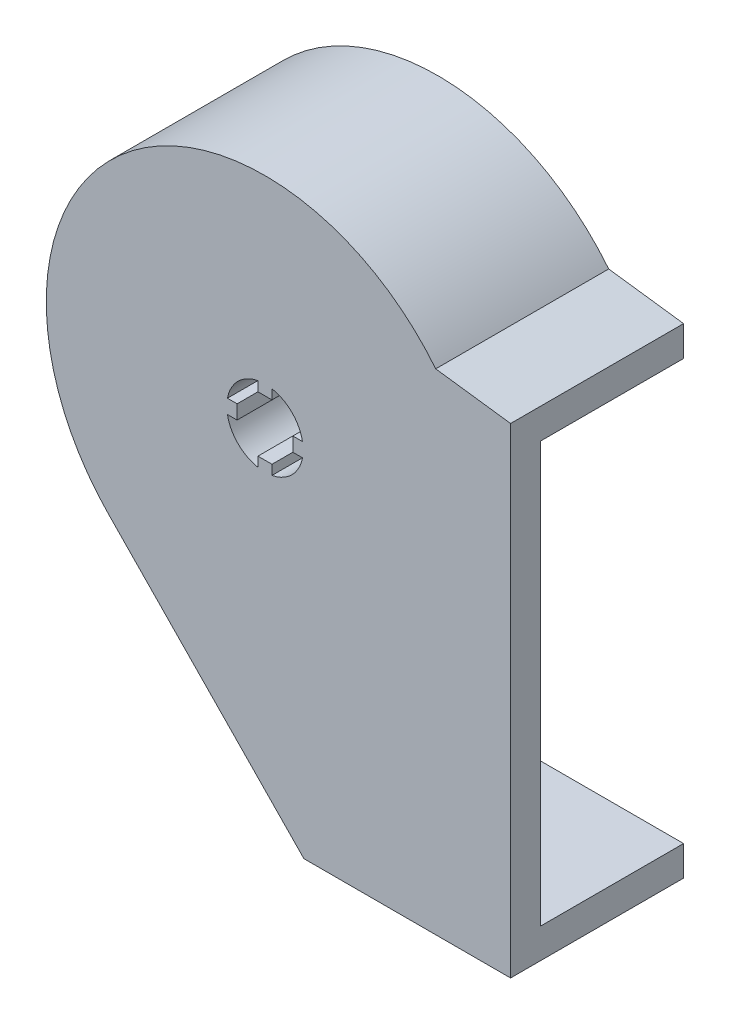
ISO-10303-21;
HEADER;
FILE_DESCRIPTION(('STEP AP214'),'2;1');
FILE_NAME('part.step','',(''),(''),'','','');
FILE_SCHEMA(('AUTOMOTIVE_DESIGN { 1 0 10303 214 1 1 1 1 }'));
ENDSEC;
DATA;
#1=APPLICATION_CONTEXT('core data for automotive mechanical design processes');
#2=APPLICATION_PROTOCOL_DEFINITION('international standard','automotive_design',2000,#1);
#3=PRODUCT_CONTEXT('',#1,'mechanical');
#4=PRODUCT('Part','Part','',(#3));
#5=PRODUCT_RELATED_PRODUCT_CATEGORY('part','',(#4));
#6=PRODUCT_DEFINITION_FORMATION('','',#4);
#7=PRODUCT_DEFINITION_CONTEXT('part definition',#1,'design');
#8=PRODUCT_DEFINITION('design','',#6,#7);
#9=PRODUCT_DEFINITION_SHAPE('','',#8);
#10=(LENGTH_UNIT() NAMED_UNIT(*) SI_UNIT(.MILLI.,.METRE.));
#11=(NAMED_UNIT(*) PLANE_ANGLE_UNIT() SI_UNIT($,.RADIAN.));
#12=(NAMED_UNIT(*) SI_UNIT($,.STERADIAN.) SOLID_ANGLE_UNIT());
#13=UNCERTAINTY_MEASURE_WITH_UNIT(LENGTH_MEASURE(1.E-05),#10,'distance_accuracy_value','');
#14=(GEOMETRIC_REPRESENTATION_CONTEXT(3) GLOBAL_UNCERTAINTY_ASSIGNED_CONTEXT((#13)) GLOBAL_UNIT_ASSIGNED_CONTEXT((#10,
#11,#12)) REPRESENTATION_CONTEXT('',''));
#15=CARTESIAN_POINT('',(0.,0.,0.));
#16=DIRECTION('',(0.,0.,1.));
#17=DIRECTION('',(1.,0.,0.));
#18=AXIS2_PLACEMENT_3D('',#15,#16,#17);
#19=CARTESIAN_POINT('',(0.,0.,0.));
#20=DIRECTION('',(0.,0.,1.));
#21=DIRECTION('',(1.,0.,0.));
#22=AXIS2_PLACEMENT_3D('',#19,#20,#21);
#23=PLANE('',#22);
#24=DIRECTION('',(0.697581146157718,-0.716505788200824,0.));
#25=VECTOR('',#24,1.);
#26=CARTESIAN_POINT('',(20.1650578820082,-111.024188538423,0.));
#27=LINE('',#26,#25);
#28=CARTESIAN_POINT('',(-45.139864656652,-43.9476122079362,0.));
#29=VERTEX_POINT('',#28);
#30=CARTESIAN_POINT('',(17.2207454401962,-108.,0.));
#31=VERTEX_POINT('',#30);
#32=EDGE_CURVE('E292',#29,#31,#27,.T.);
#33=ORIENTED_EDGE('',*,*,#32,.T.);
#34=DIRECTION('',(1.,0.,0.));
#35=VECTOR('',#34,1.);
#36=CARTESIAN_POINT('',(191.,-108.,0.));
#37=LINE('',#36,#35);
#38=CARTESIAN_POINT('',(82.,-108.,0.));
#39=VERTEX_POINT('',#38);
#40=EDGE_CURVE('E48',#31,#39,#37,.T.);
#41=ORIENTED_EDGE('',*,*,#40,.T.);
#42=DIRECTION('',(0.,-1.,0.));
#43=VECTOR('',#42,1.);
#44=CARTESIAN_POINT('',(82.,0.,0.));
#45=LINE('',#44,#43);
#46=CARTESIAN_POINT('',(82.,-118.,0.));
#47=VERTEX_POINT('',#46);
#48=EDGE_CURVE('E55',#39,#47,#45,.T.);
#49=ORIENTED_EDGE('',*,*,#48,.T.);
#50=DIRECTION('',(1.,0.,0.));
#51=VECTOR('',#50,1.);
#52=CARTESIAN_POINT('',(191.,-118.,0.));
#53=LINE('',#52,#51);
#54=CARTESIAN_POINT('',(13.,-118.,0.));
#55=VERTEX_POINT('',#54);
#56=EDGE_CURVE('E288',#55,#47,#53,.T.);
#57=ORIENTED_EDGE('',*,*,#56,.F.);
#58=DIRECTION('',(0.697581146157718,-0.716505788200824,0.));
#59=VECTOR('',#58,1.);
#60=CARTESIAN_POINT('',(13.,-118.,0.));
#61=LINE('',#60,#59);
#62=CARTESIAN_POINT('',(-52.3049225386602,-50.9234236695134,0.));
#63=VERTEX_POINT('',#62);
#64=EDGE_CURVE('E282',#63,#55,#61,.T.);
#65=ORIENTED_EDGE('',*,*,#64,.F.);
#66=CARTESIAN_POINT('',(0.,0.,0.));
#67=DIRECTION('',(0.,0.,1.));
#68=DIRECTION('',(1.,0.,0.));
#69=AXIS2_PLACEMENT_3D('',#66,#67,#68);
#70=CIRCLE('',#69,73.);
#71=CARTESIAN_POINT('',(57.,45.6070170039656,0.));
#72=VERTEX_POINT('',#71);
#73=EDGE_CURVE('E284',#72,#63,#70,.T.);
#74=ORIENTED_EDGE('',*,*,#73,.F.);
#75=DIRECTION('',(-0.991422127874872,0.130698754240664,0.));
#76=VECTOR('',#75,1.);
#77=CARTESIAN_POINT('',(274.,17.,0.));
#78=LINE('',#77,#76);
#79=CARTESIAN_POINT('',(82.,42.3112777177944,0.));
#80=VERTEX_POINT('',#79);
#81=EDGE_CURVE('E286',#80,#72,#78,.T.);
#82=ORIENTED_EDGE('',*,*,#81,.F.);
#83=CARTESIAN_POINT('',(82.,32.2247568314438,0.));
#84=VERTEX_POINT('',#83);
#85=EDGE_CURVE('E290',#80,#84,#45,.T.);
#86=ORIENTED_EDGE('',*,*,#85,.T.);
#87=DIRECTION('',(-0.991422127874872,0.130698754240664,0.));
#88=VECTOR('',#87,1.);
#89=CARTESIAN_POINT('',(272.693012457593,7.08577872125128,0.));
#90=LINE('',#89,#88);
#91=CARTESIAN_POINT('',(51.532195013357,36.2413145057591,0.));
#92=VERTEX_POINT('',#91);
#93=EDGE_CURVE('E221',#84,#92,#90,.T.);
#94=ORIENTED_EDGE('',*,*,#93,.T.);
#95=CARTESIAN_POINT('',(0.,0.,0.));
#96=DIRECTION('',(0.,0.,1.));
#97=DIRECTION('',(1.,0.,0.));
#98=AXIS2_PLACEMENT_3D('',#95,#96,#97);
#99=CIRCLE('',#98,63.);
#100=EDGE_CURVE('E295',#92,#29,#99,.T.);
#101=ORIENTED_EDGE('',*,*,#100,.T.);
#102=EDGE_LOOP('',(#33,#41,#49,#57,#65,#74,#82,#86,#94,#101));
#103=FACE_BOUND('',#102,.T.);
#104=ADVANCED_FACE('F40',(#103),#23,.F.);
#105=CARTESIAN_POINT('',(0.,0.,0.));
#106=DIRECTION('',(0.,0.,1.));
#107=DIRECTION('',(1.,0.,0.));
#108=AXIS2_PLACEMENT_3D('',#105,#106,#107);
#109=CIRCLE('',#108,22.75);
#110=CARTESIAN_POINT('',(22.75,0.,0.));
#111=VERTEX_POINT('',#110);
#112=EDGE_CURVE('E11',#111,#111,#109,.F.);
#113=ORIENTED_EDGE('',*,*,#112,.T.);
#114=EDGE_LOOP('',(#113));
#115=FACE_BOUND('',#114,.T.);
#116=DIRECTION('',(1.,0.,0.));
#117=VECTOR('',#116,1.);
#118=CARTESIAN_POINT('',(2.35,9.3,0.));
#119=LINE('',#118,#117);
#120=CARTESIAN_POINT('',(-2.35,9.3,0.));
#121=VERTEX_POINT('',#120);
#122=CARTESIAN_POINT('',(2.35,9.3,0.));
#123=VERTEX_POINT('',#122);
#124=EDGE_CURVE('E277',#121,#123,#119,.T.);
#125=ORIENTED_EDGE('',*,*,#124,.F.);
#126=DIRECTION('',(0.,-1.,0.));
#127=VECTOR('',#126,1.);
#128=CARTESIAN_POINT('',(-2.35,9.3,0.));
#129=LINE('',#128,#127);
#130=CARTESIAN_POINT('',(-2.35,12.5315601582564,0.));
#131=VERTEX_POINT('',#130);
#132=EDGE_CURVE('E275',#131,#121,#129,.T.);
#133=ORIENTED_EDGE('',*,*,#132,.F.);
#134=CARTESIAN_POINT('',(0.,0.,0.));
#135=DIRECTION('',(0.,0.,1.));
#136=DIRECTION('',(1.,0.,0.));
#137=AXIS2_PLACEMENT_3D('',#134,#135,#136);
#138=CIRCLE('',#137,12.75);
#139=CARTESIAN_POINT('',(-12.5315601582564,2.35,0.));
#140=VERTEX_POINT('',#139);
#141=EDGE_CURVE('E273',#140,#131,#138,.F.);
#142=ORIENTED_EDGE('',*,*,#141,.F.);
#143=DIRECTION('',(-1.,0.,0.));
#144=VECTOR('',#143,1.);
#145=CARTESIAN_POINT('',(-9.3,2.35,0.));
#146=LINE('',#145,#144);
#147=CARTESIAN_POINT('',(-9.3,2.35,0.));
#148=VERTEX_POINT('',#147);
#149=EDGE_CURVE('E271',#148,#140,#146,.T.);
#150=ORIENTED_EDGE('',*,*,#149,.F.);
#151=DIRECTION('',(0.,1.,0.));
#152=VECTOR('',#151,1.);
#153=CARTESIAN_POINT('',(-9.3,2.35,0.));
#154=LINE('',#153,#152);
#155=CARTESIAN_POINT('',(-9.3,-2.35,0.));
#156=VERTEX_POINT('',#155);
#157=EDGE_CURVE('E269',#156,#148,#154,.T.);
#158=ORIENTED_EDGE('',*,*,#157,.F.);
#159=DIRECTION('',(1.,0.,0.));
#160=VECTOR('',#159,1.);
#161=CARTESIAN_POINT('',(-9.3,-2.35,0.));
#162=LINE('',#161,#160);
#163=CARTESIAN_POINT('',(-12.5315601582564,-2.35,0.));
#164=VERTEX_POINT('',#163);
#165=EDGE_CURVE('E267',#164,#156,#162,.T.);
#166=ORIENTED_EDGE('',*,*,#165,.F.);
#167=CARTESIAN_POINT('',(0.,0.,0.));
#168=DIRECTION('',(0.,0.,1.));
#169=DIRECTION('',(1.,0.,0.));
#170=AXIS2_PLACEMENT_3D('',#167,#168,#169);
#171=CIRCLE('',#170,12.75);
#172=CARTESIAN_POINT('',(-2.35,-12.5315601582564,0.));
#173=VERTEX_POINT('',#172);
#174=EDGE_CURVE('E265',#173,#164,#171,.F.);
#175=ORIENTED_EDGE('',*,*,#174,.F.);
#176=DIRECTION('',(0.,-1.,0.));
#177=VECTOR('',#176,1.);
#178=CARTESIAN_POINT('',(-2.35,-9.3,0.));
#179=LINE('',#178,#177);
#180=CARTESIAN_POINT('',(-2.35,-9.3,0.));
#181=VERTEX_POINT('',#180);
#182=EDGE_CURVE('E263',#181,#173,#179,.T.);
#183=ORIENTED_EDGE('',*,*,#182,.F.);
#184=DIRECTION('',(-1.,0.,0.));
#185=VECTOR('',#184,1.);
#186=CARTESIAN_POINT('',(-2.35,-9.3,0.));
#187=LINE('',#186,#185);
#188=CARTESIAN_POINT('',(2.35,-9.3,0.));
#189=VERTEX_POINT('',#188);
#190=EDGE_CURVE('E261',#189,#181,#187,.T.);
#191=ORIENTED_EDGE('',*,*,#190,.F.);
#192=DIRECTION('',(0.,1.,0.));
#193=VECTOR('',#192,1.);
#194=CARTESIAN_POINT('',(2.35,-9.3,0.));
#195=LINE('',#194,#193);
#196=CARTESIAN_POINT('',(2.35,-12.5315601582564,0.));
#197=VERTEX_POINT('',#196);
#198=EDGE_CURVE('E259',#197,#189,#195,.T.);
#199=ORIENTED_EDGE('',*,*,#198,.F.);
#200=CARTESIAN_POINT('',(0.,0.,0.));
#201=DIRECTION('',(0.,0.,1.));
#202=DIRECTION('',(1.,0.,0.));
#203=AXIS2_PLACEMENT_3D('',#200,#201,#202);
#204=CIRCLE('',#203,12.75);
#205=CARTESIAN_POINT('',(12.5315601582564,-2.34999999999999,0.));
#206=VERTEX_POINT('',#205);
#207=EDGE_CURVE('E257',#206,#197,#204,.F.);
#208=ORIENTED_EDGE('',*,*,#207,.F.);
#209=DIRECTION('',(1.,0.,0.));
#210=VECTOR('',#209,1.);
#211=CARTESIAN_POINT('',(9.3,-2.35,0.));
#212=LINE('',#211,#210);
#213=CARTESIAN_POINT('',(9.3,-2.35,0.));
#214=VERTEX_POINT('',#213);
#215=EDGE_CURVE('E255',#214,#206,#212,.T.);
#216=ORIENTED_EDGE('',*,*,#215,.F.);
#217=DIRECTION('',(0.,-1.,0.));
#218=VECTOR('',#217,1.);
#219=CARTESIAN_POINT('',(9.3,-2.35,0.));
#220=LINE('',#219,#218);
#221=CARTESIAN_POINT('',(9.3,2.35,0.));
#222=VERTEX_POINT('',#221);
#223=EDGE_CURVE('E253',#222,#214,#220,.T.);
#224=ORIENTED_EDGE('',*,*,#223,.F.);
#225=DIRECTION('',(-1.,0.,0.));
#226=VECTOR('',#225,1.);
#227=CARTESIAN_POINT('',(9.3,2.35,0.));
#228=LINE('',#227,#226);
#229=CARTESIAN_POINT('',(12.5315601582564,2.35,0.));
#230=VERTEX_POINT('',#229);
#231=EDGE_CURVE('E250',#230,#222,#228,.T.);
#232=ORIENTED_EDGE('',*,*,#231,.F.);
#233=CARTESIAN_POINT('',(0.,0.,0.));
#234=DIRECTION('',(0.,0.,1.));
#235=DIRECTION('',(1.,0.,0.));
#236=AXIS2_PLACEMENT_3D('',#233,#234,#235);
#237=CIRCLE('',#236,12.75);
#238=CARTESIAN_POINT('',(2.35,12.5315601582564,0.));
#239=VERTEX_POINT('',#238);
#240=EDGE_CURVE('E248',#239,#230,#237,.F.);
#241=ORIENTED_EDGE('',*,*,#240,.F.);
#242=DIRECTION('',(0.,1.,0.));
#243=VECTOR('',#242,1.);
#244=CARTESIAN_POINT('',(2.35,9.3,0.));
#245=LINE('',#244,#243);
#246=EDGE_CURVE('E280',#123,#239,#245,.T.);
#247=ORIENTED_EDGE('',*,*,#246,.F.);
#248=EDGE_LOOP('',(#125,#133,#142,#150,#158,#166,#175,#183,#191,#199,#208,#216,#224,#232,#241,#247));
#249=FACE_BOUND('',#248,.T.);
#250=ADVANCED_FACE('F42',(#115,#249),#23,.F.);
#251=CARTESIAN_POINT('',(0.,0.,57.75));
#252=DIRECTION('',(0.,0.,-1.));
#253=DIRECTION('',(-1.,0.,0.));
#254=AXIS2_PLACEMENT_3D('',#251,#252,#253);
#255=CYLINDRICAL_SURFACE('',#254,63.);
#256=ORIENTED_EDGE('',*,*,#100,.F.);
#257=DIRECTION('',(0.,0.,-1.));
#258=VECTOR('',#257,1.);
#259=CARTESIAN_POINT('',(51.532195013357,36.2413145057591,47.75));
#260=LINE('',#259,#258);
#261=CARTESIAN_POINT('',(51.532195013357,36.2413145057591,47.75));
#262=VERTEX_POINT('',#261);
#263=EDGE_CURVE('E308',#262,#92,#260,.T.);
#264=ORIENTED_EDGE('',*,*,#263,.F.);
#265=CARTESIAN_POINT('',(0.,0.,47.75));
#266=DIRECTION('',(0.,0.,1.));
#267=DIRECTION('',(1.,0.,0.));
#268=AXIS2_PLACEMENT_3D('',#265,#266,#267);
#269=CIRCLE('',#268,63.);
#270=CARTESIAN_POINT('',(-45.139864656652,-43.9476122079362,47.75));
#271=VERTEX_POINT('',#270);
#272=EDGE_CURVE('E233',#262,#271,#269,.T.);
#273=ORIENTED_EDGE('',*,*,#272,.T.);
#274=DIRECTION('',(0.,0.,1.));
#275=VECTOR('',#274,1.);
#276=CARTESIAN_POINT('',(-45.139864656652,-43.9476122079362,57.75));
#277=LINE('',#276,#275);
#278=EDGE_CURVE('E305',#271,#29,#277,.F.);
#279=ORIENTED_EDGE('',*,*,#278,.T.);
#280=EDGE_LOOP('',(#256,#264,#273,#279));
#281=FACE_BOUND('',#280,.T.);
#282=ADVANCED_FACE('F431',(#281),#255,.F.);
#283=CARTESIAN_POINT('',(82.,0.,0.));
#284=DIRECTION('',(1.,0.,0.));
#285=DIRECTION('',(0.,0.,-1.));
#286=AXIS2_PLACEMENT_3D('',#283,#284,#285);
#287=PLANE('',#286);
#288=ORIENTED_EDGE('',*,*,#85,.F.);
#289=DIRECTION('',(0.,0.,1.));
#290=VECTOR('',#289,1.);
#291=CARTESIAN_POINT('',(82.,42.3112777177944,57.75));
#292=LINE('',#291,#290);
#293=CARTESIAN_POINT('',(82.,42.3112777177944,57.75));
#294=VERTEX_POINT('',#293);
#295=EDGE_CURVE('E237',#80,#294,#292,.T.);
#296=ORIENTED_EDGE('',*,*,#295,.T.);
#297=DIRECTION('',(0.,1.,0.));
#298=VECTOR('',#297,1.);
#299=CARTESIAN_POINT('',(82.,0.,57.75));
#300=LINE('',#299,#298);
#301=CARTESIAN_POINT('',(82.,-118.,57.75));
#302=VERTEX_POINT('',#301);
#303=EDGE_CURVE('E244',#302,#294,#300,.T.);
#304=ORIENTED_EDGE('',*,*,#303,.F.);
#305=DIRECTION('',(0.,0.,-1.));
#306=VECTOR('',#305,1.);
#307=CARTESIAN_POINT('',(82.,-118.,57.75));
#308=LINE('',#307,#306);
#309=EDGE_CURVE('E239',#302,#47,#308,.T.);
#310=ORIENTED_EDGE('',*,*,#309,.T.);
#311=ORIENTED_EDGE('',*,*,#48,.F.);
#312=DIRECTION('',(0.,0.,-1.));
#313=VECTOR('',#312,1.);
#314=CARTESIAN_POINT('',(82.,-108.,57.75));
#315=LINE('',#314,#313);
#316=CARTESIAN_POINT('',(82.,-108.,47.75));
#317=VERTEX_POINT('',#316);
#318=EDGE_CURVE('E224',#317,#39,#315,.T.);
#319=ORIENTED_EDGE('',*,*,#318,.F.);
#320=DIRECTION('',(0.,1.,0.));
#321=VECTOR('',#320,1.);
#322=CARTESIAN_POINT('',(82.,0.,47.75));
#323=LINE('',#322,#321);
#324=CARTESIAN_POINT('',(82.,32.2247568314438,47.75));
#325=VERTEX_POINT('',#324);
#326=EDGE_CURVE('E231',#317,#325,#323,.T.);
#327=ORIENTED_EDGE('',*,*,#326,.T.);
#328=DIRECTION('',(0.,0.,1.));
#329=VECTOR('',#328,1.);
#330=CARTESIAN_POINT('',(82.,32.2247568314438,57.75));
#331=LINE('',#330,#329);
#332=EDGE_CURVE('E214',#84,#325,#331,.T.);
#333=ORIENTED_EDGE('',*,*,#332,.F.);
#334=EDGE_LOOP('',(#288,#296,#304,#310,#311,#319,#327,#333));
#335=FACE_BOUND('',#334,.T.);
#336=ADVANCED_FACE('F236',(#335),#287,.T.);
#337=CARTESIAN_POINT('',(274.,17.,57.75));
#338=DIRECTION('',(-0.130698754240664,-0.991422127874872,0.));
#339=DIRECTION('',(0.991422127874872,-0.130698754240664,0.));
#340=AXIS2_PLACEMENT_3D('',#337,#338,#339);
#341=PLANE('',#340);
#342=ORIENTED_EDGE('',*,*,#295,.F.);
#343=ORIENTED_EDGE('',*,*,#81,.T.);
#344=DIRECTION('',(0.,0.,-1.));
#345=VECTOR('',#344,1.);
#346=CARTESIAN_POINT('',(57.,45.6070170039656,57.75));
#347=LINE('',#346,#345);
#348=CARTESIAN_POINT('',(57.,45.6070170039656,57.75));
#349=VERTEX_POINT('',#348);
#350=EDGE_CURVE('E322',#349,#72,#347,.T.);
#351=ORIENTED_EDGE('',*,*,#350,.F.);
#352=DIRECTION('',(-0.991422127874872,0.130698754240664,0.));
#353=VECTOR('',#352,1.);
#354=CARTESIAN_POINT('',(274.,17.,57.75));
#355=LINE('',#354,#353);
#356=EDGE_CURVE('E325',#294,#349,#355,.T.);
#357=ORIENTED_EDGE('',*,*,#356,.F.);
#358=EDGE_LOOP('',(#342,#343,#351,#357));
#359=FACE_BOUND('',#358,.T.);
#360=ADVANCED_FACE('F442',(#359),#341,.F.);
#361=CARTESIAN_POINT('',(2.35,9.3,57.75));
#362=DIRECTION('',(0.,1.,0.));
#363=DIRECTION('',(0.,0.,1.));
#364=AXIS2_PLACEMENT_3D('',#361,#362,#363);
#365=PLANE('',#364);
#366=DIRECTION('',(0.,0.,-1.));
#367=VECTOR('',#366,1.);
#368=CARTESIAN_POINT('',(-2.35,9.3,57.75));
#369=LINE('',#368,#367);
#370=CARTESIAN_POINT('',(-2.35,9.3,57.75));
#371=VERTEX_POINT('',#370);
#372=EDGE_CURVE('E376',#371,#121,#369,.T.);
#373=ORIENTED_EDGE('',*,*,#372,.T.);
#374=ORIENTED_EDGE('',*,*,#124,.T.);
#375=DIRECTION('',(0.,0.,-1.));
#376=VECTOR('',#375,1.);
#377=CARTESIAN_POINT('',(2.35,9.3,57.75));
#378=LINE('',#377,#376);
#379=CARTESIAN_POINT('',(2.35,9.3,57.75));
#380=VERTEX_POINT('',#379);
#381=EDGE_CURVE('E332',#380,#123,#378,.T.);
#382=ORIENTED_EDGE('',*,*,#381,.F.);
#383=DIRECTION('',(1.,0.,0.));
#384=VECTOR('',#383,1.);
#385=CARTESIAN_POINT('',(2.35,9.3,57.75));
#386=LINE('',#385,#384);
#387=EDGE_CURVE('E336',#371,#380,#386,.T.);
#388=ORIENTED_EDGE('',*,*,#387,.F.);
#389=EDGE_LOOP('',(#373,#374,#382,#388));
#390=FACE_BOUND('',#389,.T.);
#391=ADVANCED_FACE('F557',(#390),#365,.F.);
#392=CARTESIAN_POINT('',(-2.35,9.3,57.75));
#393=DIRECTION('',(1.,0.,0.));
#394=DIRECTION('',(0.,1.,0.));
#395=AXIS2_PLACEMENT_3D('',#392,#393,#394);
#396=PLANE('',#395);
#397=DIRECTION('',(0.,0.,-1.));
#398=VECTOR('',#397,1.);
#399=CARTESIAN_POINT('',(-2.35,12.5315601582564,57.75));
#400=LINE('',#399,#398);
#401=CARTESIAN_POINT('',(-2.35,12.5315601582564,57.75));
#402=VERTEX_POINT('',#401);
#403=EDGE_CURVE('E373',#402,#131,#400,.T.);
#404=ORIENTED_EDGE('',*,*,#403,.T.);
#405=ORIENTED_EDGE('',*,*,#132,.T.);
#406=ORIENTED_EDGE('',*,*,#372,.F.);
#407=DIRECTION('',(0.,-1.,0.));
#408=VECTOR('',#407,1.);
#409=CARTESIAN_POINT('',(-2.35,9.3,57.75));
#410=LINE('',#409,#408);
#411=EDGE_CURVE('E383',#402,#371,#410,.T.);
#412=ORIENTED_EDGE('',*,*,#411,.F.);
#413=EDGE_LOOP('',(#404,#405,#406,#412));
#414=FACE_BOUND('',#413,.T.);
#415=ADVANCED_FACE('F554',(#414),#396,.F.);
#416=CARTESIAN_POINT('',(0.,0.,57.75));
#417=DIRECTION('',(0.,0.,-1.));
#418=DIRECTION('',(-1.,0.,0.));
#419=AXIS2_PLACEMENT_3D('',#416,#417,#418);
#420=CYLINDRICAL_SURFACE('',#419,12.75);
#421=DIRECTION('',(0.,0.,-1.));
#422=VECTOR('',#421,1.);
#423=CARTESIAN_POINT('',(-12.5315601582564,2.35,57.75));
#424=LINE('',#423,#422);
#425=CARTESIAN_POINT('',(-12.5315601582564,2.35,57.75));
#426=VERTEX_POINT('',#425);
#427=EDGE_CURVE('E370',#426,#140,#424,.T.);
#428=ORIENTED_EDGE('',*,*,#427,.T.);
#429=ORIENTED_EDGE('',*,*,#141,.T.);
#430=ORIENTED_EDGE('',*,*,#403,.F.);
#431=CARTESIAN_POINT('',(0.,0.,57.75));
#432=DIRECTION('',(0.,0.,-1.));
#433=DIRECTION('',(-1.,0.,0.));
#434=AXIS2_PLACEMENT_3D('',#431,#432,#433);
#435=CIRCLE('',#434,12.75);
#436=EDGE_CURVE('E386',#426,#402,#435,.T.);
#437=ORIENTED_EDGE('',*,*,#436,.F.);
#438=EDGE_LOOP('',(#428,#429,#430,#437));
#439=FACE_BOUND('',#438,.T.);
#440=ADVANCED_FACE('F550',(#439),#420,.F.);
#441=CARTESIAN_POINT('',(-9.3,2.35,57.75));
#442=DIRECTION('',(0.,-1.,0.));
#443=DIRECTION('',(1.,0.,0.));
#444=AXIS2_PLACEMENT_3D('',#441,#442,#443);
#445=PLANE('',#444);
#446=DIRECTION('',(0.,0.,-1.));
#447=VECTOR('',#446,1.);
#448=CARTESIAN_POINT('',(-9.3,2.35,57.75));
#449=LINE('',#448,#447);
#450=CARTESIAN_POINT('',(-9.3,2.35,57.75));
#451=VERTEX_POINT('',#450);
#452=EDGE_CURVE('E367',#451,#148,#449,.T.);
#453=ORIENTED_EDGE('',*,*,#452,.T.);
#454=ORIENTED_EDGE('',*,*,#149,.T.);
#455=ORIENTED_EDGE('',*,*,#427,.F.);
#456=DIRECTION('',(-1.,0.,0.));
#457=VECTOR('',#456,1.);
#458=CARTESIAN_POINT('',(-9.3,2.35,57.75));
#459=LINE('',#458,#457);
#460=EDGE_CURVE('E389',#451,#426,#459,.T.);
#461=ORIENTED_EDGE('',*,*,#460,.F.);
#462=EDGE_LOOP('',(#453,#454,#455,#461));
#463=FACE_BOUND('',#462,.T.);
#464=ADVANCED_FACE('F546',(#463),#445,.F.);
#465=CARTESIAN_POINT('',(-9.3,2.35,57.75));
#466=DIRECTION('',(-1.,0.,0.));
#467=DIRECTION('',(0.,0.,1.));
#468=AXIS2_PLACEMENT_3D('',#465,#466,#467);
#469=PLANE('',#468);
#470=DIRECTION('',(0.,0.,-1.));
#471=VECTOR('',#470,1.);
#472=CARTESIAN_POINT('',(-9.3,-2.35,57.75));
#473=LINE('',#472,#471);
#474=CARTESIAN_POINT('',(-9.3,-2.35,57.75));
#475=VERTEX_POINT('',#474);
#476=EDGE_CURVE('E364',#475,#156,#473,.T.);
#477=ORIENTED_EDGE('',*,*,#476,.T.);
#478=ORIENTED_EDGE('',*,*,#157,.T.);
#479=ORIENTED_EDGE('',*,*,#452,.F.);
#480=DIRECTION('',(0.,1.,0.));
#481=VECTOR('',#480,1.);
#482=CARTESIAN_POINT('',(-9.3,2.35,57.75));
#483=LINE('',#482,#481);
#484=EDGE_CURVE('E392',#475,#451,#483,.T.);
#485=ORIENTED_EDGE('',*,*,#484,.F.);
#486=EDGE_LOOP('',(#477,#478,#479,#485));
#487=FACE_BOUND('',#486,.T.);
#488=ADVANCED_FACE('F542',(#487),#469,.F.);
#489=CARTESIAN_POINT('',(-9.3,-2.35,57.75));
#490=DIRECTION('',(0.,1.,0.));
#491=DIRECTION('',(-1.,0.,0.));
#492=AXIS2_PLACEMENT_3D('',#489,#490,#491);
#493=PLANE('',#492);
#494=DIRECTION('',(0.,0.,-1.));
#495=VECTOR('',#494,1.);
#496=CARTESIAN_POINT('',(-12.5315601582564,-2.35,57.75));
#497=LINE('',#496,#495);
#498=CARTESIAN_POINT('',(-12.5315601582564,-2.35,57.75));
#499=VERTEX_POINT('',#498);
#500=EDGE_CURVE('E361',#499,#164,#497,.T.);
#501=ORIENTED_EDGE('',*,*,#500,.T.);
#502=ORIENTED_EDGE('',*,*,#165,.T.);
#503=ORIENTED_EDGE('',*,*,#476,.F.);
#504=DIRECTION('',(1.,0.,0.));
#505=VECTOR('',#504,1.);
#506=CARTESIAN_POINT('',(-9.3,-2.35,57.75));
#507=LINE('',#506,#505);
#508=EDGE_CURVE('E395',#499,#475,#507,.T.);
#509=ORIENTED_EDGE('',*,*,#508,.F.);
#510=EDGE_LOOP('',(#501,#502,#503,#509));
#511=FACE_BOUND('',#510,.T.);
#512=ADVANCED_FACE('F538',(#511),#493,.F.);
#513=CARTESIAN_POINT('',(0.,0.,57.75));
#514=DIRECTION('',(0.,0.,-1.));
#515=DIRECTION('',(-1.,0.,0.));
#516=AXIS2_PLACEMENT_3D('',#513,#514,#515);
#517=CYLINDRICAL_SURFACE('',#516,12.75);
#518=DIRECTION('',(0.,0.,-1.));
#519=VECTOR('',#518,1.);
#520=CARTESIAN_POINT('',(-2.35,-12.5315601582564,57.75));
#521=LINE('',#520,#519);
#522=CARTESIAN_POINT('',(-2.35,-12.5315601582564,57.75));
#523=VERTEX_POINT('',#522);
#524=EDGE_CURVE('E358',#523,#173,#521,.T.);
#525=ORIENTED_EDGE('',*,*,#524,.T.);
#526=ORIENTED_EDGE('',*,*,#174,.T.);
#527=ORIENTED_EDGE('',*,*,#500,.F.);
#528=CARTESIAN_POINT('',(0.,0.,57.75));
#529=DIRECTION('',(0.,0.,-1.));
#530=DIRECTION('',(-1.,0.,0.));
#531=AXIS2_PLACEMENT_3D('',#528,#529,#530);
#532=CIRCLE('',#531,12.75);
#533=EDGE_CURVE('E398',#523,#499,#532,.T.);
#534=ORIENTED_EDGE('',*,*,#533,.F.);
#535=EDGE_LOOP('',(#525,#526,#527,#534));
#536=FACE_BOUND('',#535,.T.);
#537=ADVANCED_FACE('F534',(#536),#517,.F.);
#538=CARTESIAN_POINT('',(-2.35,-9.3,57.75));
#539=DIRECTION('',(1.,0.,0.));
#540=DIRECTION('',(0.,1.,0.));
#541=AXIS2_PLACEMENT_3D('',#538,#539,#540);
#542=PLANE('',#541);
#543=DIRECTION('',(0.,0.,-1.));
#544=VECTOR('',#543,1.);
#545=CARTESIAN_POINT('',(-2.35,-9.3,57.75));
#546=LINE('',#545,#544);
#547=CARTESIAN_POINT('',(-2.35,-9.3,57.75));
#548=VERTEX_POINT('',#547);
#549=EDGE_CURVE('E355',#548,#181,#546,.T.);
#550=ORIENTED_EDGE('',*,*,#549,.T.);
#551=ORIENTED_EDGE('',*,*,#182,.T.);
#552=ORIENTED_EDGE('',*,*,#524,.F.);
#553=DIRECTION('',(0.,-1.,0.));
#554=VECTOR('',#553,1.);
#555=CARTESIAN_POINT('',(-2.35,-9.3,57.75));
#556=LINE('',#555,#554);
#557=EDGE_CURVE('E401',#548,#523,#556,.T.);
#558=ORIENTED_EDGE('',*,*,#557,.F.);
#559=EDGE_LOOP('',(#550,#551,#552,#558));
#560=FACE_BOUND('',#559,.T.);
#561=ADVANCED_FACE('F530',(#560),#542,.F.);
#562=CARTESIAN_POINT('',(-2.35,-9.3,57.75));
#563=DIRECTION('',(0.,-1.,0.));
#564=DIRECTION('',(0.,0.,-1.));
#565=AXIS2_PLACEMENT_3D('',#562,#563,#564);
#566=PLANE('',#565);
#567=DIRECTION('',(0.,0.,-1.));
#568=VECTOR('',#567,1.);
#569=CARTESIAN_POINT('',(2.35,-9.3,57.75));
#570=LINE('',#569,#568);
#571=CARTESIAN_POINT('',(2.35,-9.3,57.75));
#572=VERTEX_POINT('',#571);
#573=EDGE_CURVE('E352',#572,#189,#570,.T.);
#574=ORIENTED_EDGE('',*,*,#573,.T.);
#575=ORIENTED_EDGE('',*,*,#190,.T.);
#576=ORIENTED_EDGE('',*,*,#549,.F.);
#577=DIRECTION('',(-1.,0.,0.));
#578=VECTOR('',#577,1.);
#579=CARTESIAN_POINT('',(-2.35,-9.3,57.75));
#580=LINE('',#579,#578);
#581=EDGE_CURVE('E404',#572,#548,#580,.T.);
#582=ORIENTED_EDGE('',*,*,#581,.F.);
#583=EDGE_LOOP('',(#574,#575,#576,#582));
#584=FACE_BOUND('',#583,.T.);
#585=ADVANCED_FACE('F526',(#584),#566,.F.);
#586=CARTESIAN_POINT('',(2.35,-9.3,57.75));
#587=DIRECTION('',(-1.,0.,0.));
#588=DIRECTION('',(0.,-1.,0.));
#589=AXIS2_PLACEMENT_3D('',#586,#587,#588);
#590=PLANE('',#589);
#591=DIRECTION('',(0.,0.,-1.));
#592=VECTOR('',#591,1.);
#593=CARTESIAN_POINT('',(2.35,-12.5315601582564,57.75));
#594=LINE('',#593,#592);
#595=CARTESIAN_POINT('',(2.35,-12.5315601582564,57.75));
#596=VERTEX_POINT('',#595);
#597=EDGE_CURVE('E349',#596,#197,#594,.T.);
#598=ORIENTED_EDGE('',*,*,#597,.T.);
#599=ORIENTED_EDGE('',*,*,#198,.T.);
#600=ORIENTED_EDGE('',*,*,#573,.F.);
#601=DIRECTION('',(0.,1.,0.));
#602=VECTOR('',#601,1.);
#603=CARTESIAN_POINT('',(2.35,-9.3,57.75));
#604=LINE('',#603,#602);
#605=EDGE_CURVE('E407',#596,#572,#604,.T.);
#606=ORIENTED_EDGE('',*,*,#605,.F.);
#607=EDGE_LOOP('',(#598,#599,#600,#606));
#608=FACE_BOUND('',#607,.T.);
#609=ADVANCED_FACE('F522',(#608),#590,.F.);
#610=CARTESIAN_POINT('',(0.,0.,57.75));
#611=DIRECTION('',(0.,0.,-1.));
#612=DIRECTION('',(-1.,0.,0.));
#613=AXIS2_PLACEMENT_3D('',#610,#611,#612);
#614=CYLINDRICAL_SURFACE('',#613,12.75);
#615=DIRECTION('',(0.,0.,-1.));
#616=VECTOR('',#615,1.);
#617=CARTESIAN_POINT('',(12.5315601582564,-2.34999999999999,57.75));
#618=LINE('',#617,#616);
#619=CARTESIAN_POINT('',(12.5315601582564,-2.34999999999999,57.75));
#620=VERTEX_POINT('',#619);
#621=EDGE_CURVE('E346',#620,#206,#618,.T.);
#622=ORIENTED_EDGE('',*,*,#621,.T.);
#623=ORIENTED_EDGE('',*,*,#207,.T.);
#624=ORIENTED_EDGE('',*,*,#597,.F.);
#625=CARTESIAN_POINT('',(0.,0.,57.75));
#626=DIRECTION('',(0.,0.,-1.));
#627=DIRECTION('',(-1.,0.,0.));
#628=AXIS2_PLACEMENT_3D('',#625,#626,#627);
#629=CIRCLE('',#628,12.75);
#630=EDGE_CURVE('E410',#620,#596,#629,.T.);
#631=ORIENTED_EDGE('',*,*,#630,.F.);
#632=EDGE_LOOP('',(#622,#623,#624,#631));
#633=FACE_BOUND('',#632,.T.);
#634=ADVANCED_FACE('F518',(#633),#614,.F.);
#635=CARTESIAN_POINT('',(9.3,-2.35,57.75));
#636=DIRECTION('',(0.,1.,0.));
#637=DIRECTION('',(-1.,0.,0.));
#638=AXIS2_PLACEMENT_3D('',#635,#636,#637);
#639=PLANE('',#638);
#640=DIRECTION('',(0.,0.,-1.));
#641=VECTOR('',#640,1.);
#642=CARTESIAN_POINT('',(9.3,-2.35,57.75));
#643=LINE('',#642,#641);
#644=CARTESIAN_POINT('',(9.3,-2.35,57.75));
#645=VERTEX_POINT('',#644);
#646=EDGE_CURVE('E343',#645,#214,#643,.T.);
#647=ORIENTED_EDGE('',*,*,#646,.T.);
#648=ORIENTED_EDGE('',*,*,#215,.T.);
#649=ORIENTED_EDGE('',*,*,#621,.F.);
#650=DIRECTION('',(1.,0.,0.));
#651=VECTOR('',#650,1.);
#652=CARTESIAN_POINT('',(9.3,-2.35,57.75));
#653=LINE('',#652,#651);
#654=EDGE_CURVE('E413',#645,#620,#653,.T.);
#655=ORIENTED_EDGE('',*,*,#654,.F.);
#656=EDGE_LOOP('',(#647,#648,#649,#655));
#657=FACE_BOUND('',#656,.T.);
#658=ADVANCED_FACE('F500',(#657),#639,.F.);
#659=CARTESIAN_POINT('',(9.3,-2.35,57.75));
#660=DIRECTION('',(1.,0.,0.));
#661=DIRECTION('',(0.,0.,-1.));
#662=AXIS2_PLACEMENT_3D('',#659,#660,#661);
#663=PLANE('',#662);
#664=DIRECTION('',(0.,0.,-1.));
#665=VECTOR('',#664,1.);
#666=CARTESIAN_POINT('',(9.3,2.35,57.75));
#667=LINE('',#666,#665);
#668=CARTESIAN_POINT('',(9.3,2.35,57.75));
#669=VERTEX_POINT('',#668);
#670=EDGE_CURVE('E340',#669,#222,#667,.T.);
#671=ORIENTED_EDGE('',*,*,#670,.T.);
#672=ORIENTED_EDGE('',*,*,#223,.T.);
#673=ORIENTED_EDGE('',*,*,#646,.F.);
#674=DIRECTION('',(0.,-1.,0.));
#675=VECTOR('',#674,1.);
#676=CARTESIAN_POINT('',(9.3,-2.35,57.75));
#677=LINE('',#676,#675);
#678=EDGE_CURVE('E416',#669,#645,#677,.T.);
#679=ORIENTED_EDGE('',*,*,#678,.F.);
#680=EDGE_LOOP('',(#671,#672,#673,#679));
#681=FACE_BOUND('',#680,.T.);
#682=ADVANCED_FACE('F489',(#681),#663,.F.);
#683=CARTESIAN_POINT('',(0.,0.,57.75));
#684=DIRECTION('',(0.,0.,1.));
#685=DIRECTION('',(1.,0.,0.));
#686=AXIS2_PLACEMENT_3D('',#683,#684,#685);
#687=PLANE('',#686);
#688=DIRECTION('',(0.,1.,0.));
#689=VECTOR('',#688,1.);
#690=CARTESIAN_POINT('',(2.35,9.3,57.75));
#691=LINE('',#690,#689);
#692=CARTESIAN_POINT('',(2.35,12.5315601582564,57.75));
#693=VERTEX_POINT('',#692);
#694=EDGE_CURVE('E251',#380,#693,#691,.T.);
#695=ORIENTED_EDGE('',*,*,#694,.T.);
#696=CARTESIAN_POINT('',(0.,0.,57.75));
#697=DIRECTION('',(0.,0.,-1.));
#698=DIRECTION('',(-1.,0.,0.));
#699=AXIS2_PLACEMENT_3D('',#696,#697,#698);
#700=CIRCLE('',#699,12.75);
#701=CARTESIAN_POINT('',(12.5315601582564,2.35,57.75));
#702=VERTEX_POINT('',#701);
#703=EDGE_CURVE('E422',#693,#702,#700,.T.);
#704=ORIENTED_EDGE('',*,*,#703,.T.);
#705=DIRECTION('',(-1.,0.,0.));
#706=VECTOR('',#705,1.);
#707=CARTESIAN_POINT('',(9.3,2.35,57.75));
#708=LINE('',#707,#706);
#709=EDGE_CURVE('E419',#702,#669,#708,.T.);
#710=ORIENTED_EDGE('',*,*,#709,.T.);
#711=ORIENTED_EDGE('',*,*,#678,.T.);
#712=ORIENTED_EDGE('',*,*,#654,.T.);
#713=ORIENTED_EDGE('',*,*,#630,.T.);
#714=ORIENTED_EDGE('',*,*,#605,.T.);
#715=ORIENTED_EDGE('',*,*,#581,.T.);
#716=ORIENTED_EDGE('',*,*,#557,.T.);
#717=ORIENTED_EDGE('',*,*,#533,.T.);
#718=ORIENTED_EDGE('',*,*,#508,.T.);
#719=ORIENTED_EDGE('',*,*,#484,.T.);
#720=ORIENTED_EDGE('',*,*,#460,.T.);
#721=ORIENTED_EDGE('',*,*,#436,.T.);
#722=ORIENTED_EDGE('',*,*,#411,.T.);
#723=ORIENTED_EDGE('',*,*,#387,.T.);
#724=EDGE_LOOP('',(#695,#704,#710,#711,#712,#713,#714,#715,#716,#717,#718,#719,#720,#721,#722,#723));
#725=FACE_BOUND('',#724,.T.);
#726=DIRECTION('',(1.,0.,0.));
#727=VECTOR('',#726,1.);
#728=CARTESIAN_POINT('',(191.,-118.,57.75));
#729=LINE('',#728,#727);
#730=CARTESIAN_POINT('',(13.,-118.,57.75));
#731=VERTEX_POINT('',#730);
#732=EDGE_CURVE('E329',#731,#302,#729,.T.);
#733=ORIENTED_EDGE('',*,*,#732,.T.);
#734=ORIENTED_EDGE('',*,*,#303,.T.);
#735=ORIENTED_EDGE('',*,*,#356,.T.);
#736=CARTESIAN_POINT('',(0.,0.,57.75));
#737=DIRECTION('',(0.,0.,1.));
#738=DIRECTION('',(1.,0.,0.));
#739=AXIS2_PLACEMENT_3D('',#736,#737,#738);
#740=CIRCLE('',#739,73.);
#741=CARTESIAN_POINT('',(-52.3049225386602,-50.9234236695134,57.75));
#742=VERTEX_POINT('',#741);
#743=EDGE_CURVE('E328',#349,#742,#740,.T.);
#744=ORIENTED_EDGE('',*,*,#743,.T.);
#745=DIRECTION('',(0.697581146157718,-0.716505788200824,0.));
#746=VECTOR('',#745,1.);
#747=CARTESIAN_POINT('',(13.,-118.,57.75));
#748=LINE('',#747,#746);
#749=EDGE_CURVE('E326',#742,#731,#748,.T.);
#750=ORIENTED_EDGE('',*,*,#749,.T.);
#751=EDGE_LOOP('',(#733,#734,#735,#744,#750));
#752=FACE_BOUND('',#751,.T.);
#753=ADVANCED_FACE('F439',(#725,#752),#687,.T.);
#754=CARTESIAN_POINT('',(9.3,2.35,57.75));
#755=DIRECTION('',(0.,-1.,0.));
#756=DIRECTION('',(1.,0.,0.));
#757=AXIS2_PLACEMENT_3D('',#754,#755,#756);
#758=PLANE('',#757);
#759=DIRECTION('',(0.,0.,-1.));
#760=VECTOR('',#759,1.);
#761=CARTESIAN_POINT('',(12.5315601582564,2.35,57.75));
#762=LINE('',#761,#760);
#763=EDGE_CURVE('E337',#702,#230,#762,.T.);
#764=ORIENTED_EDGE('',*,*,#763,.T.);
#765=ORIENTED_EDGE('',*,*,#231,.T.);
#766=ORIENTED_EDGE('',*,*,#670,.F.);
#767=ORIENTED_EDGE('',*,*,#709,.F.);
#768=EDGE_LOOP('',(#764,#765,#766,#767));
#769=FACE_BOUND('',#768,.T.);
#770=ADVANCED_FACE('F488',(#769),#758,.F.);
#771=CARTESIAN_POINT('',(2.35,9.3,57.75));
#772=DIRECTION('',(-1.,0.,0.));
#773=DIRECTION('',(0.,-1.,0.));
#774=AXIS2_PLACEMENT_3D('',#771,#772,#773);
#775=PLANE('',#774);
#776=ORIENTED_EDGE('',*,*,#381,.T.);
#777=ORIENTED_EDGE('',*,*,#246,.T.);
#778=DIRECTION('',(0.,0.,-1.));
#779=VECTOR('',#778,1.);
#780=CARTESIAN_POINT('',(2.35,12.5315601582564,57.75));
#781=LINE('',#780,#779);
#782=EDGE_CURVE('E333',#693,#239,#781,.T.);
#783=ORIENTED_EDGE('',*,*,#782,.F.);
#784=ORIENTED_EDGE('',*,*,#694,.F.);
#785=EDGE_LOOP('',(#776,#777,#783,#784));
#786=FACE_BOUND('',#785,.T.);
#787=ADVANCED_FACE('F462',(#786),#775,.F.);
#788=CARTESIAN_POINT('',(0.,0.,57.75));
#789=DIRECTION('',(0.,0.,-1.));
#790=DIRECTION('',(-1.,0.,0.));
#791=AXIS2_PLACEMENT_3D('',#788,#789,#790);
#792=CYLINDRICAL_SURFACE('',#791,12.75);
#793=ORIENTED_EDGE('',*,*,#782,.T.);
#794=ORIENTED_EDGE('',*,*,#240,.T.);
#795=ORIENTED_EDGE('',*,*,#763,.F.);
#796=ORIENTED_EDGE('',*,*,#703,.F.);
#797=EDGE_LOOP('',(#793,#794,#795,#796));
#798=FACE_BOUND('',#797,.T.);
#799=ADVANCED_FACE('F455',(#798),#792,.F.);
#800=CARTESIAN_POINT('',(191.,-118.,57.75));
#801=DIRECTION('',(0.,1.,0.));
#802=DIRECTION('',(-1.,0.,0.));
#803=AXIS2_PLACEMENT_3D('',#800,#801,#802);
#804=PLANE('',#803);
#805=DIRECTION('',(0.,0.,-1.));
#806=VECTOR('',#805,1.);
#807=CARTESIAN_POINT('',(13.,-118.,57.75));
#808=LINE('',#807,#806);
#809=EDGE_CURVE('E319',#731,#55,#808,.T.);
#810=ORIENTED_EDGE('',*,*,#809,.T.);
#811=ORIENTED_EDGE('',*,*,#56,.T.);
#812=ORIENTED_EDGE('',*,*,#309,.F.);
#813=ORIENTED_EDGE('',*,*,#732,.F.);
#814=EDGE_LOOP('',(#810,#811,#812,#813));
#815=FACE_BOUND('',#814,.T.);
#816=ADVANCED_FACE('F453',(#815),#804,.F.);
#817=CARTESIAN_POINT('',(0.,0.,57.75));
#818=DIRECTION('',(0.,0.,-1.));
#819=DIRECTION('',(-1.,0.,0.));
#820=AXIS2_PLACEMENT_3D('',#817,#818,#819);
#821=CYLINDRICAL_SURFACE('',#820,73.);
#822=ORIENTED_EDGE('',*,*,#350,.T.);
#823=ORIENTED_EDGE('',*,*,#73,.T.);
#824=DIRECTION('',(0.,0.,-1.));
#825=VECTOR('',#824,1.);
#826=CARTESIAN_POINT('',(-52.3049225386602,-50.9234236695134,57.75));
#827=LINE('',#826,#825);
#828=EDGE_CURVE('E316',#742,#63,#827,.T.);
#829=ORIENTED_EDGE('',*,*,#828,.F.);
#830=ORIENTED_EDGE('',*,*,#743,.F.);
#831=EDGE_LOOP('',(#822,#823,#829,#830));
#832=FACE_BOUND('',#831,.T.);
#833=ADVANCED_FACE('F446',(#832),#821,.T.);
#834=CARTESIAN_POINT('',(13.,-118.,57.75));
#835=DIRECTION('',(0.716505788200824,0.697581146157718,0.));
#836=DIRECTION('',(-0.697581146157718,0.716505788200824,0.));
#837=AXIS2_PLACEMENT_3D('',#834,#835,#836);
#838=PLANE('',#837);
#839=ORIENTED_EDGE('',*,*,#828,.T.);
#840=ORIENTED_EDGE('',*,*,#64,.T.);
#841=ORIENTED_EDGE('',*,*,#809,.F.);
#842=ORIENTED_EDGE('',*,*,#749,.F.);
#843=EDGE_LOOP('',(#839,#840,#841,#842));
#844=FACE_BOUND('',#843,.T.);
#845=ADVANCED_FACE('F449',(#844),#838,.F.);
#846=CARTESIAN_POINT('',(0.,0.,47.75));
#847=DIRECTION('',(0.,0.,1.));
#848=DIRECTION('',(1.,0.,0.));
#849=AXIS2_PLACEMENT_3D('',#846,#847,#848);
#850=PLANE('',#849);
#851=CARTESIAN_POINT('',(0.,0.,47.75));
#852=DIRECTION('',(0.,0.,1.));
#853=DIRECTION('',(1.,0.,0.));
#854=AXIS2_PLACEMENT_3D('',#851,#852,#853);
#855=CIRCLE('',#854,22.75);
#856=CARTESIAN_POINT('',(22.75,0.,47.75));
#857=VERTEX_POINT('',#856);
#858=EDGE_CURVE('E306',#857,#857,#855,.F.);
#859=ORIENTED_EDGE('',*,*,#858,.F.);
#860=EDGE_LOOP('',(#859));
#861=FACE_BOUND('',#860,.T.);
#862=ORIENTED_EDGE('',*,*,#326,.F.);
#863=DIRECTION('',(1.,0.,0.));
#864=VECTOR('',#863,1.);
#865=CARTESIAN_POINT('',(191.,-108.,47.75));
#866=LINE('',#865,#864);
#867=CARTESIAN_POINT('',(17.2207454401962,-108.,47.75));
#868=VERTEX_POINT('',#867);
#869=EDGE_CURVE('E234',#868,#317,#866,.T.);
#870=ORIENTED_EDGE('',*,*,#869,.F.);
#871=DIRECTION('',(0.697581146157718,-0.716505788200824,0.));
#872=VECTOR('',#871,1.);
#873=CARTESIAN_POINT('',(20.1650578820082,-111.024188538423,47.75));
#874=LINE('',#873,#872);
#875=EDGE_CURVE('E304',#271,#868,#874,.T.);
#876=ORIENTED_EDGE('',*,*,#875,.F.);
#877=ORIENTED_EDGE('',*,*,#272,.F.);
#878=DIRECTION('',(-0.991422127874872,0.130698754240664,0.));
#879=VECTOR('',#878,1.);
#880=CARTESIAN_POINT('',(272.693012457593,7.08577872125128,47.75));
#881=LINE('',#880,#879);
#882=EDGE_CURVE('E218',#325,#262,#881,.T.);
#883=ORIENTED_EDGE('',*,*,#882,.F.);
#884=EDGE_LOOP('',(#862,#870,#876,#877,#883));
#885=FACE_BOUND('',#884,.T.);
#886=ADVANCED_FACE('F229',(#861,#885),#850,.F.);
#887=CARTESIAN_POINT('',(0.,0.,57.75));
#888=DIRECTION('',(0.,0.,-1.));
#889=DIRECTION('',(-1.,0.,0.));
#890=AXIS2_PLACEMENT_3D('',#887,#888,#889);
#891=CYLINDRICAL_SURFACE('',#890,22.75);
#892=ORIENTED_EDGE('',*,*,#112,.F.);
#893=EDGE_LOOP('',(#892));
#894=FACE_BOUND('',#893,.T.);
#895=ORIENTED_EDGE('',*,*,#858,.T.);
#896=EDGE_LOOP('',(#895));
#897=FACE_BOUND('',#896,.T.);
#898=ADVANCED_FACE('F485',(#894,#897),#891,.T.);
#899=CARTESIAN_POINT('',(20.1650578820082,-111.024188538423,57.75));
#900=DIRECTION('',(0.716505788200824,0.697581146157718,0.));
#901=DIRECTION('',(-0.697581146157718,0.716505788200824,0.));
#902=AXIS2_PLACEMENT_3D('',#899,#900,#901);
#903=PLANE('',#902);
#904=ORIENTED_EDGE('',*,*,#32,.F.);
#905=ORIENTED_EDGE('',*,*,#278,.F.);
#906=ORIENTED_EDGE('',*,*,#875,.T.);
#907=DIRECTION('',(0.,0.,-1.));
#908=VECTOR('',#907,1.);
#909=CARTESIAN_POINT('',(17.2207454401962,-108.,57.75));
#910=LINE('',#909,#908);
#911=EDGE_CURVE('E302',#868,#31,#910,.T.);
#912=ORIENTED_EDGE('',*,*,#911,.T.);
#913=EDGE_LOOP('',(#904,#905,#906,#912));
#914=FACE_BOUND('',#913,.T.);
#915=ADVANCED_FACE('F303',(#914),#903,.T.);
#916=CARTESIAN_POINT('',(191.,-108.,57.75));
#917=DIRECTION('',(0.,1.,0.));
#918=DIRECTION('',(-1.,0.,0.));
#919=AXIS2_PLACEMENT_3D('',#916,#917,#918);
#920=PLANE('',#919);
#921=ORIENTED_EDGE('',*,*,#40,.F.);
#922=ORIENTED_EDGE('',*,*,#911,.F.);
#923=ORIENTED_EDGE('',*,*,#869,.T.);
#924=ORIENTED_EDGE('',*,*,#318,.T.);
#925=EDGE_LOOP('',(#921,#922,#923,#924));
#926=FACE_BOUND('',#925,.T.);
#927=ADVANCED_FACE('F429',(#926),#920,.T.);
#928=CARTESIAN_POINT('',(272.693012457593,7.08577872125128,57.75));
#929=DIRECTION('',(-0.130698754240664,-0.991422127874872,0.));
#930=DIRECTION('',(0.991422127874872,-0.130698754240664,0.));
#931=AXIS2_PLACEMENT_3D('',#928,#929,#930);
#932=PLANE('',#931);
#933=ORIENTED_EDGE('',*,*,#93,.F.);
#934=ORIENTED_EDGE('',*,*,#332,.T.);
#935=ORIENTED_EDGE('',*,*,#882,.T.);
#936=ORIENTED_EDGE('',*,*,#263,.T.);
#937=EDGE_LOOP('',(#933,#934,#935,#936));
#938=FACE_BOUND('',#937,.T.);
#939=ADVANCED_FACE('F216',(#938),#932,.T.);
#940=CLOSED_SHELL('',(#104,#250,#282,#336,#360,#391,#415,#440,#464,#488,#512,#537,#561,#585,
#609,#634,#658,#682,#753,#770,#787,#799,#816,#833,#845,#886,#898,#915,#927,#939));
#941=MANIFOLD_SOLID_BREP('B2',#940);
#942=ADVANCED_BREP_SHAPE_REPRESENTATION('',(#18,#941),#14);
#943=SHAPE_DEFINITION_REPRESENTATION(#9,#942);
ENDSEC;
END-ISO-10303-21;
